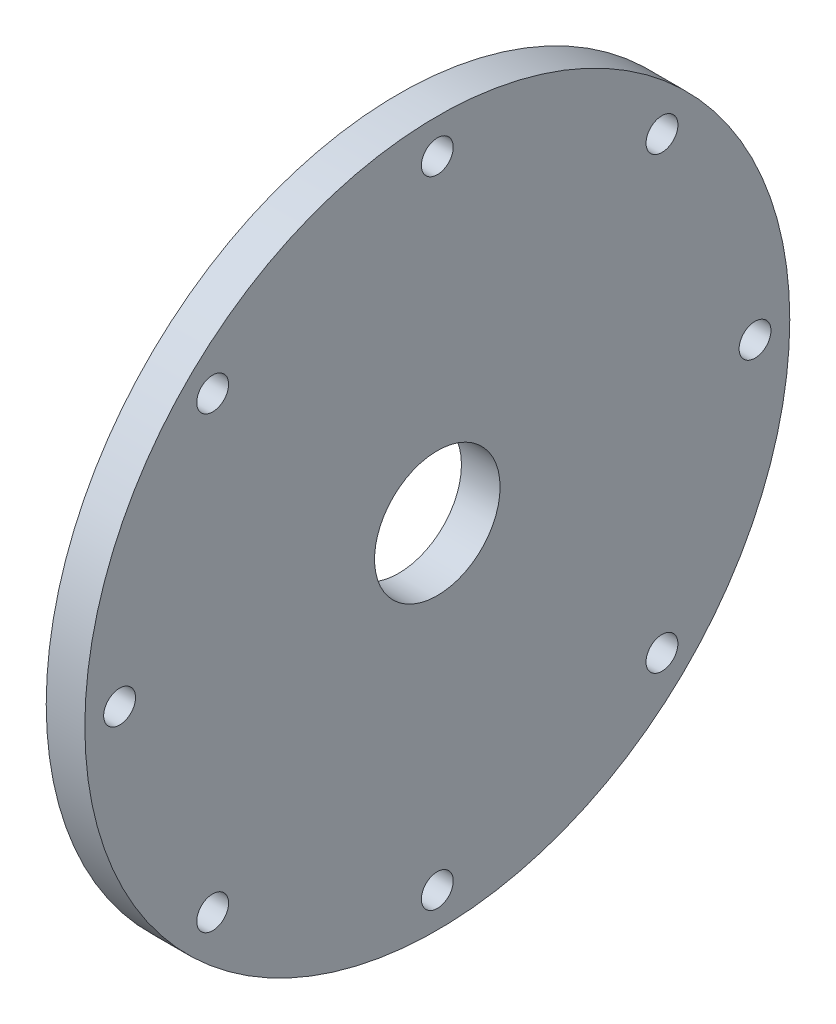
ISO-10303-21;
HEADER;
FILE_DESCRIPTION(('STEP AP214'),'2;1');
FILE_NAME('part.step','',(''),(''),'','','');
FILE_SCHEMA(('AUTOMOTIVE_DESIGN { 1 0 10303 214 1 1 1 1 }'));
ENDSEC;
DATA;
#1=APPLICATION_CONTEXT('core data for automotive mechanical design processes');
#2=APPLICATION_PROTOCOL_DEFINITION('international standard','automotive_design',2000,#1);
#3=PRODUCT_CONTEXT('',#1,'mechanical');
#4=PRODUCT('Part','Part','',(#3));
#5=PRODUCT_RELATED_PRODUCT_CATEGORY('part','',(#4));
#6=PRODUCT_DEFINITION_FORMATION('','',#4);
#7=PRODUCT_DEFINITION_CONTEXT('part definition',#1,'design');
#8=PRODUCT_DEFINITION('design','',#6,#7);
#9=PRODUCT_DEFINITION_SHAPE('','',#8);
#10=(LENGTH_UNIT() NAMED_UNIT(*) SI_UNIT(.MILLI.,.METRE.));
#11=(NAMED_UNIT(*) PLANE_ANGLE_UNIT() SI_UNIT($,.RADIAN.));
#12=(NAMED_UNIT(*) SI_UNIT($,.STERADIAN.) SOLID_ANGLE_UNIT());
#13=UNCERTAINTY_MEASURE_WITH_UNIT(LENGTH_MEASURE(1.E-05),#10,'distance_accuracy_value','');
#14=(GEOMETRIC_REPRESENTATION_CONTEXT(3) GLOBAL_UNCERTAINTY_ASSIGNED_CONTEXT((#13)) GLOBAL_UNIT_ASSIGNED_CONTEXT((#10,
#11,#12)) REPRESENTATION_CONTEXT('',''));
#15=CARTESIAN_POINT('',(0.,0.,0.));
#16=DIRECTION('',(0.,0.,1.));
#17=DIRECTION('',(1.,0.,0.));
#18=AXIS2_PLACEMENT_3D('',#15,#16,#17);
#19=CARTESIAN_POINT('',(4.,0.,0.));
#20=DIRECTION('',(1.,0.,0.));
#21=DIRECTION('',(0.,0.,-1.));
#22=AXIS2_PLACEMENT_3D('',#19,#20,#21);
#23=PLANE('',#22);
#24=CARTESIAN_POINT('',(4.,32.9,-3.44609208143817E-13));
#25=DIRECTION('',(1.,0.,0.));
#26=DIRECTION('',(0.,0.,-1.));
#27=AXIS2_PLACEMENT_3D('',#24,#25,#26);
#28=CIRCLE('',#27,1.65);
#29=CARTESIAN_POINT('',(4.,32.9,-1.65000000000034));
#30=VERTEX_POINT('',#29);
#31=EDGE_CURVE('E86',#30,#30,#28,.T.);
#32=ORIENTED_EDGE('',*,*,#31,.F.);
#33=EDGE_LOOP('',(#32));
#34=FACE_BOUND('',#33,.T.);
#35=CARTESIAN_POINT('',(4.,23.2638131010371,-23.2638131010377));
#36=DIRECTION('',(1.,0.,0.));
#37=DIRECTION('',(0.,0.,-1.));
#38=AXIS2_PLACEMENT_3D('',#35,#36,#37);
#39=CIRCLE('',#38,1.65);
#40=CARTESIAN_POINT('',(4.,23.2638131010371,-24.9138131010377));
#41=VERTEX_POINT('',#40);
#42=EDGE_CURVE('E94',#41,#41,#39,.T.);
#43=ORIENTED_EDGE('',*,*,#42,.F.);
#44=EDGE_LOOP('',(#43));
#45=FACE_BOUND('',#44,.T.);
#46=CARTESIAN_POINT('',(4.,0.,-32.9));
#47=DIRECTION('',(1.,0.,0.));
#48=DIRECTION('',(0.,0.,-1.));
#49=AXIS2_PLACEMENT_3D('',#46,#47,#48);
#50=CIRCLE('',#49,1.65);
#51=CARTESIAN_POINT('',(4.,0.,-34.55));
#52=VERTEX_POINT('',#51);
#53=EDGE_CURVE('E90',#52,#52,#50,.T.);
#54=ORIENTED_EDGE('',*,*,#53,.F.);
#55=EDGE_LOOP('',(#54));
#56=FACE_BOUND('',#55,.T.);
#57=CARTESIAN_POINT('',(4.,-23.2638131010374,-23.2638131010374));
#58=DIRECTION('',(1.,0.,0.));
#59=DIRECTION('',(0.,0.,-1.));
#60=AXIS2_PLACEMENT_3D('',#57,#58,#59);
#61=CIRCLE('',#60,1.65);
#62=CARTESIAN_POINT('',(4.,-23.2638131010374,-24.9138131010374));
#63=VERTEX_POINT('',#62);
#64=EDGE_CURVE('E87',#63,#63,#61,.T.);
#65=ORIENTED_EDGE('',*,*,#64,.F.);
#66=EDGE_LOOP('',(#65));
#67=FACE_BOUND('',#66,.T.);
#68=CARTESIAN_POINT('',(4.,-32.9,1.14869736047939E-13));
#69=DIRECTION('',(1.,0.,0.));
#70=DIRECTION('',(0.,0.,-1.));
#71=AXIS2_PLACEMENT_3D('',#68,#69,#70);
#72=CIRCLE('',#71,1.65);
#73=CARTESIAN_POINT('',(4.,-32.9,-1.64999999999988));
#74=VERTEX_POINT('',#73);
#75=EDGE_CURVE('E91',#74,#74,#72,.T.);
#76=ORIENTED_EDGE('',*,*,#75,.F.);
#77=EDGE_LOOP('',(#76));
#78=FACE_BOUND('',#77,.T.);
#79=CARTESIAN_POINT('',(4.,-23.2638131010373,23.2638131010375));
#80=DIRECTION('',(1.,0.,0.));
#81=DIRECTION('',(0.,0.,-1.));
#82=AXIS2_PLACEMENT_3D('',#79,#80,#81);
#83=CIRCLE('',#82,1.65);
#84=CARTESIAN_POINT('',(4.,-23.2638131010373,21.6138131010375));
#85=VERTEX_POINT('',#84);
#86=EDGE_CURVE('E102',#85,#85,#83,.T.);
#87=ORIENTED_EDGE('',*,*,#86,.F.);
#88=EDGE_LOOP('',(#87));
#89=FACE_BOUND('',#88,.T.);
#90=CARTESIAN_POINT('',(4.,2.29739472095878E-13,32.9));
#91=DIRECTION('',(1.,0.,0.));
#92=DIRECTION('',(0.,0.,-1.));
#93=AXIS2_PLACEMENT_3D('',#90,#91,#92);
#94=CIRCLE('',#93,1.65);
#95=CARTESIAN_POINT('',(4.,2.29739472095878E-13,31.25));
#96=VERTEX_POINT('',#95);
#97=EDGE_CURVE('E99',#96,#96,#94,.T.);
#98=ORIENTED_EDGE('',*,*,#97,.F.);
#99=EDGE_LOOP('',(#98));
#100=FACE_BOUND('',#99,.T.);
#101=CARTESIAN_POINT('',(4.,23.2638131010376,23.2638131010372));
#102=DIRECTION('',(1.,0.,0.));
#103=DIRECTION('',(0.,0.,-1.));
#104=AXIS2_PLACEMENT_3D('',#101,#102,#103);
#105=CIRCLE('',#104,1.65);
#106=CARTESIAN_POINT('',(4.,23.2638131010376,21.6138131010372));
#107=VERTEX_POINT('',#106);
#108=EDGE_CURVE('E56',#107,#107,#105,.T.);
#109=ORIENTED_EDGE('',*,*,#108,.F.);
#110=EDGE_LOOP('',(#109));
#111=FACE_BOUND('',#110,.T.);
#112=CARTESIAN_POINT('',(4.,0.,0.));
#113=DIRECTION('',(1.,0.,0.));
#114=DIRECTION('',(0.,0.,-1.));
#115=AXIS2_PLACEMENT_3D('',#112,#113,#114);
#116=CIRCLE('',#115,36.5);
#117=CARTESIAN_POINT('',(4.,0.,-36.5));
#118=VERTEX_POINT('',#117);
#119=EDGE_CURVE('E10',#118,#118,#116,.T.);
#120=ORIENTED_EDGE('',*,*,#119,.T.);
#121=EDGE_LOOP('',(#120));
#122=FACE_BOUND('',#121,.T.);
#123=CARTESIAN_POINT('',(4.,0.,0.));
#124=DIRECTION('',(1.,0.,0.));
#125=DIRECTION('',(0.,0.,-1.));
#126=AXIS2_PLACEMENT_3D('',#123,#124,#125);
#127=CIRCLE('',#126,6.5);
#128=CARTESIAN_POINT('',(4.,0.,-6.5));
#129=VERTEX_POINT('',#128);
#130=EDGE_CURVE('E46',#129,#129,#127,.T.);
#131=ORIENTED_EDGE('',*,*,#130,.F.);
#132=EDGE_LOOP('',(#131));
#133=FACE_BOUND('',#132,.T.);
#134=ADVANCED_FACE('F33',(#34,#45,#56,#67,#78,#89,#100,#111,#122,#133),#23,.T.);
#135=CARTESIAN_POINT('',(0.,0.,0.));
#136=DIRECTION('',(1.,0.,0.));
#137=DIRECTION('',(0.,0.,-1.));
#138=AXIS2_PLACEMENT_3D('',#135,#136,#137);
#139=PLANE('',#138);
#140=CARTESIAN_POINT('',(0.,32.9,-3.44609208143817E-13));
#141=DIRECTION('',(1.,0.,0.));
#142=DIRECTION('',(0.,0.,-1.));
#143=AXIS2_PLACEMENT_3D('',#140,#141,#142);
#144=CIRCLE('',#143,1.65);
#145=CARTESIAN_POINT('',(0.,32.9,-1.65000000000034));
#146=VERTEX_POINT('',#145);
#147=EDGE_CURVE('E37',#146,#146,#144,.T.);
#148=ORIENTED_EDGE('',*,*,#147,.T.);
#149=EDGE_LOOP('',(#148));
#150=FACE_BOUND('',#149,.T.);
#151=CARTESIAN_POINT('',(0.,23.2638131010371,-23.2638131010377));
#152=DIRECTION('',(1.,0.,0.));
#153=DIRECTION('',(0.,0.,-1.));
#154=AXIS2_PLACEMENT_3D('',#151,#152,#153);
#155=CIRCLE('',#154,1.65);
#156=CARTESIAN_POINT('',(0.,23.2638131010371,-24.9138131010377));
#157=VERTEX_POINT('',#156);
#158=EDGE_CURVE('E70',#157,#157,#155,.T.);
#159=ORIENTED_EDGE('',*,*,#158,.T.);
#160=EDGE_LOOP('',(#159));
#161=FACE_BOUND('',#160,.T.);
#162=CARTESIAN_POINT('',(0.,0.,-32.9));
#163=DIRECTION('',(1.,0.,0.));
#164=DIRECTION('',(0.,0.,-1.));
#165=AXIS2_PLACEMENT_3D('',#162,#163,#164);
#166=CIRCLE('',#165,1.65);
#167=CARTESIAN_POINT('',(0.,0.,-34.55));
#168=VERTEX_POINT('',#167);
#169=EDGE_CURVE('E68',#168,#168,#166,.T.);
#170=ORIENTED_EDGE('',*,*,#169,.T.);
#171=EDGE_LOOP('',(#170));
#172=FACE_BOUND('',#171,.T.);
#173=CARTESIAN_POINT('',(0.,-23.2638131010374,-23.2638131010374));
#174=DIRECTION('',(1.,0.,0.));
#175=DIRECTION('',(0.,0.,-1.));
#176=AXIS2_PLACEMENT_3D('',#173,#174,#175);
#177=CIRCLE('',#176,1.65);
#178=CARTESIAN_POINT('',(0.,-23.2638131010374,-24.9138131010374));
#179=VERTEX_POINT('',#178);
#180=EDGE_CURVE('E65',#179,#179,#177,.T.);
#181=ORIENTED_EDGE('',*,*,#180,.T.);
#182=EDGE_LOOP('',(#181));
#183=FACE_BOUND('',#182,.T.);
#184=CARTESIAN_POINT('',(0.,-32.9,1.14869736047939E-13));
#185=DIRECTION('',(1.,0.,0.));
#186=DIRECTION('',(0.,0.,-1.));
#187=AXIS2_PLACEMENT_3D('',#184,#185,#186);
#188=CIRCLE('',#187,1.65);
#189=CARTESIAN_POINT('',(0.,-32.9,-1.64999999999988));
#190=VERTEX_POINT('',#189);
#191=EDGE_CURVE('E62',#190,#190,#188,.T.);
#192=ORIENTED_EDGE('',*,*,#191,.T.);
#193=EDGE_LOOP('',(#192));
#194=FACE_BOUND('',#193,.T.);
#195=CARTESIAN_POINT('',(0.,-23.2638131010373,23.2638131010375));
#196=DIRECTION('',(1.,0.,0.));
#197=DIRECTION('',(0.,0.,-1.));
#198=AXIS2_PLACEMENT_3D('',#195,#196,#197);
#199=CIRCLE('',#198,1.65);
#200=CARTESIAN_POINT('',(0.,-23.2638131010373,21.6138131010375));
#201=VERTEX_POINT('',#200);
#202=EDGE_CURVE('E59',#201,#201,#199,.T.);
#203=ORIENTED_EDGE('',*,*,#202,.T.);
#204=EDGE_LOOP('',(#203));
#205=FACE_BOUND('',#204,.T.);
#206=CARTESIAN_POINT('',(0.,2.29739472095878E-13,32.9));
#207=DIRECTION('',(1.,0.,0.));
#208=DIRECTION('',(0.,0.,-1.));
#209=AXIS2_PLACEMENT_3D('',#206,#207,#208);
#210=CIRCLE('',#209,1.65);
#211=CARTESIAN_POINT('',(0.,2.29739472095878E-13,31.25));
#212=VERTEX_POINT('',#211);
#213=EDGE_CURVE('E55',#212,#212,#210,.T.);
#214=ORIENTED_EDGE('',*,*,#213,.T.);
#215=EDGE_LOOP('',(#214));
#216=FACE_BOUND('',#215,.T.);
#217=CARTESIAN_POINT('',(0.,23.2638131010376,23.2638131010372));
#218=DIRECTION('',(1.,0.,0.));
#219=DIRECTION('',(0.,0.,-1.));
#220=AXIS2_PLACEMENT_3D('',#217,#218,#219);
#221=CIRCLE('',#220,1.65);
#222=CARTESIAN_POINT('',(0.,23.2638131010376,21.6138131010372));
#223=VERTEX_POINT('',#222);
#224=EDGE_CURVE('E52',#223,#223,#221,.T.);
#225=ORIENTED_EDGE('',*,*,#224,.T.);
#226=EDGE_LOOP('',(#225));
#227=FACE_BOUND('',#226,.T.);
#228=CARTESIAN_POINT('',(0.,0.,0.));
#229=DIRECTION('',(1.,0.,0.));
#230=DIRECTION('',(0.,0.,-1.));
#231=AXIS2_PLACEMENT_3D('',#228,#229,#230);
#232=CIRCLE('',#231,36.5);
#233=CARTESIAN_POINT('',(0.,0.,-36.5));
#234=VERTEX_POINT('',#233);
#235=EDGE_CURVE('E41',#234,#234,#232,.T.);
#236=ORIENTED_EDGE('',*,*,#235,.F.);
#237=EDGE_LOOP('',(#236));
#238=FACE_BOUND('',#237,.T.);
#239=CARTESIAN_POINT('',(0.,0.,0.));
#240=DIRECTION('',(1.,0.,0.));
#241=DIRECTION('',(0.,0.,-1.));
#242=AXIS2_PLACEMENT_3D('',#239,#240,#241);
#243=CIRCLE('',#242,6.5);
#244=CARTESIAN_POINT('',(0.,0.,-6.5));
#245=VERTEX_POINT('',#244);
#246=EDGE_CURVE('E49',#245,#245,#243,.T.);
#247=ORIENTED_EDGE('',*,*,#246,.T.);
#248=EDGE_LOOP('',(#247));
#249=FACE_BOUND('',#248,.T.);
#250=ADVANCED_FACE('F113',(#150,#161,#172,#183,#194,#205,#216,#227,#238,#249),#139,.F.);
#251=CARTESIAN_POINT('',(4.,0.,0.));
#252=DIRECTION('',(-1.,0.,0.));
#253=DIRECTION('',(0.,0.,1.));
#254=AXIS2_PLACEMENT_3D('',#251,#252,#253);
#255=CYLINDRICAL_SURFACE('',#254,36.5);
#256=ORIENTED_EDGE('',*,*,#119,.F.);
#257=EDGE_LOOP('',(#256));
#258=FACE_BOUND('',#257,.T.);
#259=ORIENTED_EDGE('',*,*,#235,.T.);
#260=EDGE_LOOP('',(#259));
#261=FACE_BOUND('',#260,.T.);
#262=ADVANCED_FACE('F35',(#258,#261),#255,.T.);
#263=CARTESIAN_POINT('',(4.,0.,0.));
#264=DIRECTION('',(-1.,0.,0.));
#265=DIRECTION('',(0.,0.,1.));
#266=AXIS2_PLACEMENT_3D('',#263,#264,#265);
#267=CYLINDRICAL_SURFACE('',#266,6.5);
#268=ORIENTED_EDGE('',*,*,#130,.T.);
#269=EDGE_LOOP('',(#268));
#270=FACE_BOUND('',#269,.T.);
#271=ORIENTED_EDGE('',*,*,#246,.F.);
#272=EDGE_LOOP('',(#271));
#273=FACE_BOUND('',#272,.T.);
#274=ADVANCED_FACE('F127',(#270,#273),#267,.F.);
#275=CARTESIAN_POINT('',(-2.,23.2638131010376,23.2638131010372));
#276=DIRECTION('',(1.,0.,0.));
#277=DIRECTION('',(0.,0.,-1.));
#278=AXIS2_PLACEMENT_3D('',#275,#276,#277);
#279=CYLINDRICAL_SURFACE('',#278,1.65);
#280=ORIENTED_EDGE('',*,*,#108,.T.);
#281=EDGE_LOOP('',(#280));
#282=FACE_BOUND('',#281,.T.);
#283=ORIENTED_EDGE('',*,*,#224,.F.);
#284=EDGE_LOOP('',(#283));
#285=FACE_BOUND('',#284,.T.);
#286=ADVANCED_FACE('F123',(#282,#285),#279,.F.);
#287=CARTESIAN_POINT('',(-2.,2.29739472095878E-13,32.9));
#288=DIRECTION('',(1.,0.,0.));
#289=DIRECTION('',(0.,0.,-1.));
#290=AXIS2_PLACEMENT_3D('',#287,#288,#289);
#291=CYLINDRICAL_SURFACE('',#290,1.65);
#292=ORIENTED_EDGE('',*,*,#97,.T.);
#293=EDGE_LOOP('',(#292));
#294=FACE_BOUND('',#293,.T.);
#295=ORIENTED_EDGE('',*,*,#213,.F.);
#296=EDGE_LOOP('',(#295));
#297=FACE_BOUND('',#296,.T.);
#298=ADVANCED_FACE('F126',(#294,#297),#291,.F.);
#299=CARTESIAN_POINT('',(-2.,-23.2638131010373,23.2638131010375));
#300=DIRECTION('',(1.,0.,0.));
#301=DIRECTION('',(0.,0.,-1.));
#302=AXIS2_PLACEMENT_3D('',#299,#300,#301);
#303=CYLINDRICAL_SURFACE('',#302,1.65);
#304=ORIENTED_EDGE('',*,*,#86,.T.);
#305=EDGE_LOOP('',(#304));
#306=FACE_BOUND('',#305,.T.);
#307=ORIENTED_EDGE('',*,*,#202,.F.);
#308=EDGE_LOOP('',(#307));
#309=FACE_BOUND('',#308,.T.);
#310=ADVANCED_FACE('F163',(#306,#309),#303,.F.);
#311=CARTESIAN_POINT('',(-2.,-32.9,1.14869736047939E-13));
#312=DIRECTION('',(1.,0.,0.));
#313=DIRECTION('',(0.,0.,-1.));
#314=AXIS2_PLACEMENT_3D('',#311,#312,#313);
#315=CYLINDRICAL_SURFACE('',#314,1.65);
#316=ORIENTED_EDGE('',*,*,#75,.T.);
#317=EDGE_LOOP('',(#316));
#318=FACE_BOUND('',#317,.T.);
#319=ORIENTED_EDGE('',*,*,#191,.F.);
#320=EDGE_LOOP('',(#319));
#321=FACE_BOUND('',#320,.T.);
#322=ADVANCED_FACE('F108',(#318,#321),#315,.F.);
#323=CARTESIAN_POINT('',(-2.,-23.2638131010374,-23.2638131010374));
#324=DIRECTION('',(1.,0.,0.));
#325=DIRECTION('',(0.,0.,-1.));
#326=AXIS2_PLACEMENT_3D('',#323,#324,#325);
#327=CYLINDRICAL_SURFACE('',#326,1.65);
#328=ORIENTED_EDGE('',*,*,#64,.T.);
#329=EDGE_LOOP('',(#328));
#330=FACE_BOUND('',#329,.T.);
#331=ORIENTED_EDGE('',*,*,#180,.F.);
#332=EDGE_LOOP('',(#331));
#333=FACE_BOUND('',#332,.T.);
#334=ADVANCED_FACE('F145',(#330,#333),#327,.F.);
#335=CARTESIAN_POINT('',(-2.,0.,-32.9));
#336=DIRECTION('',(1.,0.,0.));
#337=DIRECTION('',(0.,0.,-1.));
#338=AXIS2_PLACEMENT_3D('',#335,#336,#337);
#339=CYLINDRICAL_SURFACE('',#338,1.65);
#340=ORIENTED_EDGE('',*,*,#53,.T.);
#341=EDGE_LOOP('',(#340));
#342=FACE_BOUND('',#341,.T.);
#343=ORIENTED_EDGE('',*,*,#169,.F.);
#344=EDGE_LOOP('',(#343));
#345=FACE_BOUND('',#344,.T.);
#346=ADVANCED_FACE('F148',(#342,#345),#339,.F.);
#347=CARTESIAN_POINT('',(-2.,23.2638131010371,-23.2638131010377));
#348=DIRECTION('',(1.,0.,0.));
#349=DIRECTION('',(0.,0.,-1.));
#350=AXIS2_PLACEMENT_3D('',#347,#348,#349);
#351=CYLINDRICAL_SURFACE('',#350,1.65);
#352=ORIENTED_EDGE('',*,*,#42,.T.);
#353=EDGE_LOOP('',(#352));
#354=FACE_BOUND('',#353,.T.);
#355=ORIENTED_EDGE('',*,*,#158,.F.);
#356=EDGE_LOOP('',(#355));
#357=FACE_BOUND('',#356,.T.);
#358=ADVANCED_FACE('F152',(#354,#357),#351,.F.);
#359=CARTESIAN_POINT('',(-2.,32.9,-3.44609208143817E-13));
#360=DIRECTION('',(1.,0.,0.));
#361=DIRECTION('',(0.,0.,-1.));
#362=AXIS2_PLACEMENT_3D('',#359,#360,#361);
#363=CYLINDRICAL_SURFACE('',#362,1.65);
#364=ORIENTED_EDGE('',*,*,#31,.T.);
#365=EDGE_LOOP('',(#364));
#366=FACE_BOUND('',#365,.T.);
#367=ORIENTED_EDGE('',*,*,#147,.F.);
#368=EDGE_LOOP('',(#367));
#369=FACE_BOUND('',#368,.T.);
#370=ADVANCED_FACE('F156',(#366,#369),#363,.F.);
#371=CLOSED_SHELL('',(#134,#250,#262,#274,#286,#298,#310,#322,#334,#346,#358,#370));
#372=MANIFOLD_SOLID_BREP('B2',#371);
#373=ADVANCED_BREP_SHAPE_REPRESENTATION('',(#18,#372),#14);
#374=SHAPE_DEFINITION_REPRESENTATION(#9,#373);
ENDSEC;
END-ISO-10303-21;
